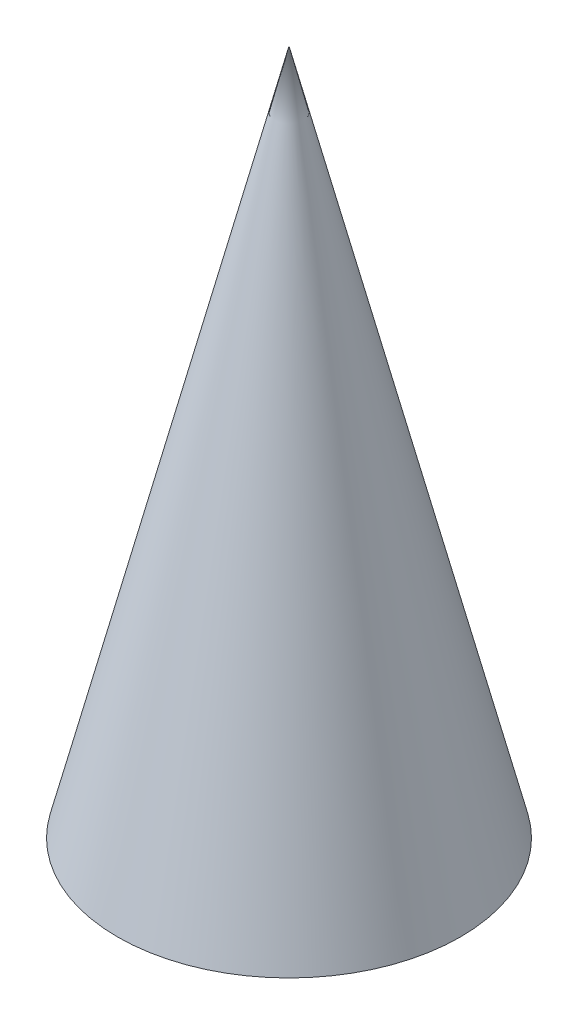
ISO-10303-21;
HEADER;
FILE_DESCRIPTION(('STEP AP214'),'2;1');
FILE_NAME('part.step','',(''),(''),'','','');
FILE_SCHEMA(('AUTOMOTIVE_DESIGN { 1 0 10303 214 1 1 1 1 }'));
ENDSEC;
DATA;
#1=APPLICATION_CONTEXT('core data for automotive mechanical design processes');
#2=APPLICATION_PROTOCOL_DEFINITION('international standard','automotive_design',2000,#1);
#3=PRODUCT_CONTEXT('',#1,'mechanical');
#4=PRODUCT('Part','Part','',(#3));
#5=PRODUCT_RELATED_PRODUCT_CATEGORY('part','',(#4));
#6=PRODUCT_DEFINITION_FORMATION('','',#4);
#7=PRODUCT_DEFINITION_CONTEXT('part definition',#1,'design');
#8=PRODUCT_DEFINITION('design','',#6,#7);
#9=PRODUCT_DEFINITION_SHAPE('','',#8);
#10=(LENGTH_UNIT() NAMED_UNIT(*) SI_UNIT(.MILLI.,.METRE.));
#11=(NAMED_UNIT(*) PLANE_ANGLE_UNIT() SI_UNIT($,.RADIAN.));
#12=(NAMED_UNIT(*) SI_UNIT($,.STERADIAN.) SOLID_ANGLE_UNIT());
#13=UNCERTAINTY_MEASURE_WITH_UNIT(LENGTH_MEASURE(1.E-05),#10,'distance_accuracy_value','');
#14=(GEOMETRIC_REPRESENTATION_CONTEXT(3) GLOBAL_UNCERTAINTY_ASSIGNED_CONTEXT((#13)) GLOBAL_UNIT_ASSIGNED_CONTEXT((#10,
#11,#12)) REPRESENTATION_CONTEXT('',''));
#15=CARTESIAN_POINT('',(0.,0.,0.));
#16=DIRECTION('',(0.,0.,1.));
#17=DIRECTION('',(1.,0.,0.));
#18=AXIS2_PLACEMENT_3D('',#15,#16,#17);
#19=CARTESIAN_POINT('',(0.,0.,0.));
#20=DIRECTION('',(0.,1.,0.));
#21=DIRECTION('',(0.,0.,1.));
#22=AXIS2_PLACEMENT_3D('',#19,#20,#21);
#23=PLANE('',#22);
#24=CARTESIAN_POINT('',(0.,0.,0.));
#25=DIRECTION('',(0.,1.,0.));
#26=DIRECTION('',(0.,0.,1.));
#27=AXIS2_PLACEMENT_3D('',#24,#25,#26);
#28=CIRCLE('',#27,25.);
#29=CARTESIAN_POINT('',(0.,0.,25.));
#30=VERTEX_POINT('',#29);
#31=EDGE_CURVE('E11',#30,#30,#28,.T.);
#32=ORIENTED_EDGE('',*,*,#31,.F.);
#33=EDGE_LOOP('',(#32));
#34=FACE_BOUND('',#33,.T.);
#35=ADVANCED_FACE('F39',(#34),#23,.F.);
#36=CARTESIAN_POINT('',(0.,0.,0.));
#37=DIRECTION('',(0.,-1.,0.));
#38=DIRECTION('',(0.,0.,-1.));
#39=AXIS2_PLACEMENT_3D('',#36,#37,#38);
#40=CONICAL_SURFACE('',#39,25.,0.244978663126864);
#41=CARTESIAN_POINT('',(0.,100.,0.));
#42=VERTEX_POINT('',#41);
#43=VERTEX_LOOP('',#42);
#44=FACE_BOUND('',#43,.T.);
#45=ORIENTED_EDGE('',*,*,#31,.T.);
#46=EDGE_LOOP('',(#45));
#47=FACE_BOUND('',#46,.T.);
#48=ADVANCED_FACE('F46',(#44,#47),#40,.T.);
#49=CLOSED_SHELL('',(#35,#48));
#50=MANIFOLD_SOLID_BREP('B2',#49);
#51=ADVANCED_BREP_SHAPE_REPRESENTATION('',(#18,#50),#14);
#52=SHAPE_DEFINITION_REPRESENTATION(#9,#51);
ENDSEC;
END-ISO-10303-21;
